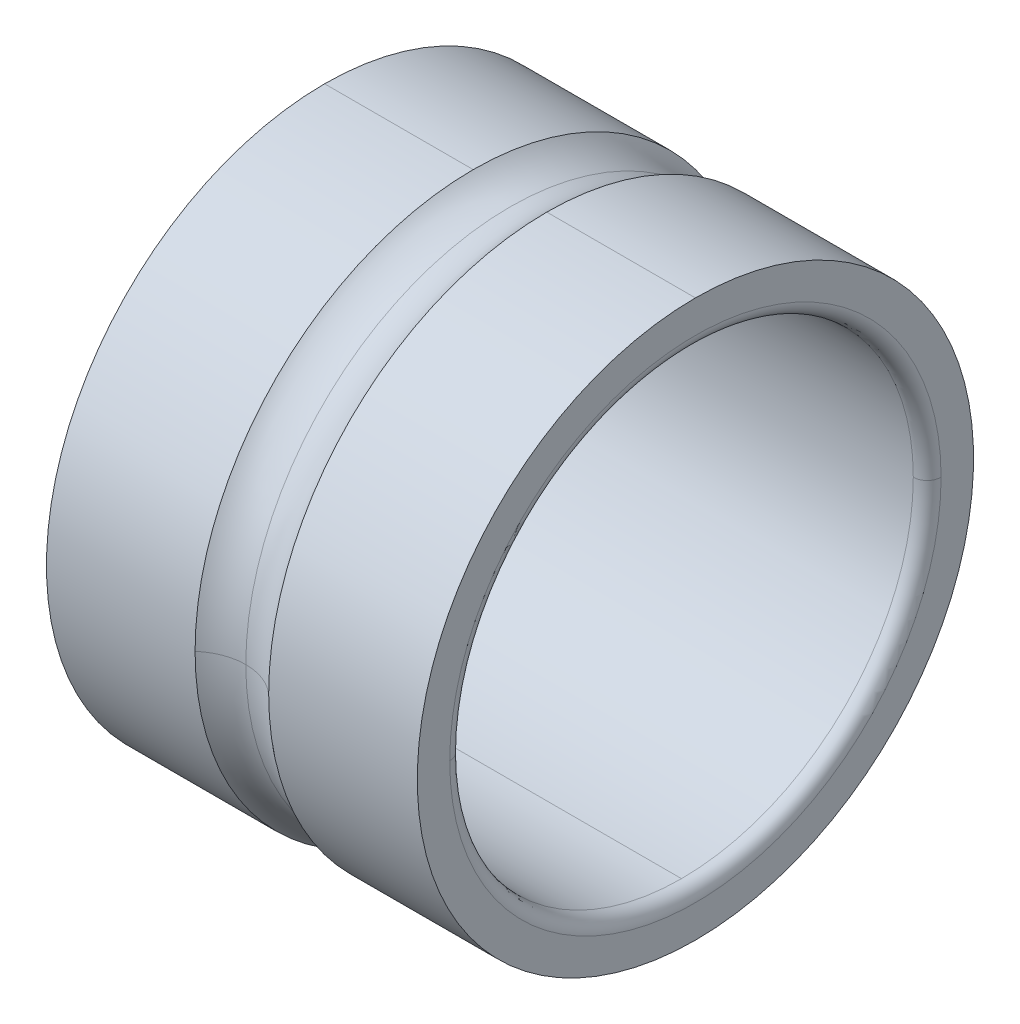
ISO-10303-21;
HEADER;
FILE_DESCRIPTION(('STEP AP214'),'2;1');
FILE_NAME('part.step','',(''),(''),'','','');
FILE_SCHEMA(('AUTOMOTIVE_DESIGN { 1 0 10303 214 1 1 1 1 }'));
ENDSEC;
DATA;
#1=APPLICATION_CONTEXT('core data for automotive mechanical design processes');
#2=APPLICATION_PROTOCOL_DEFINITION('international standard','automotive_design',2000,#1);
#3=PRODUCT_CONTEXT('',#1,'mechanical');
#4=PRODUCT('Part','Part','',(#3));
#5=PRODUCT_RELATED_PRODUCT_CATEGORY('part','',(#4));
#6=PRODUCT_DEFINITION_FORMATION('','',#4);
#7=PRODUCT_DEFINITION_CONTEXT('part definition',#1,'design');
#8=PRODUCT_DEFINITION('design','',#6,#7);
#9=PRODUCT_DEFINITION_SHAPE('','',#8);
#10=(LENGTH_UNIT() NAMED_UNIT(*) SI_UNIT(.MILLI.,.METRE.));
#11=(NAMED_UNIT(*) PLANE_ANGLE_UNIT() SI_UNIT($,.RADIAN.));
#12=(NAMED_UNIT(*) SI_UNIT($,.STERADIAN.) SOLID_ANGLE_UNIT());
#13=UNCERTAINTY_MEASURE_WITH_UNIT(LENGTH_MEASURE(1.E-05),#10,'distance_accuracy_value','');
#14=(GEOMETRIC_REPRESENTATION_CONTEXT(3) GLOBAL_UNCERTAINTY_ASSIGNED_CONTEXT((#13)) GLOBAL_UNIT_ASSIGNED_CONTEXT((#10,
#11,#12)) REPRESENTATION_CONTEXT('',''));
#15=CARTESIAN_POINT('',(0.,0.,0.));
#16=DIRECTION('',(0.,0.,1.));
#17=DIRECTION('',(1.,0.,0.));
#18=AXIS2_PLACEMENT_3D('',#15,#16,#17);
#19=CARTESIAN_POINT('',(3.19843134832985,0.,0.));
#20=DIRECTION('',(1.,0.,0.));
#21=DIRECTION('',(0.,1.,0.));
#22=AXIS2_PLACEMENT_3D('',#19,#20,#21);
#23=CYLINDRICAL_SURFACE('',#22,3.);
#24=DIRECTION('',(1.,0.,0.));
#25=VECTOR('',#24,1.);
#26=CARTESIAN_POINT('',(3.19843134832985,3.,0.));
#27=LINE('',#26,#25);
#28=CARTESIAN_POINT('',(2.39686269665969,3.,0.));
#29=VERTEX_POINT('',#28);
#30=CARTESIAN_POINT('',(4.,3.,0.));
#31=VERTEX_POINT('',#30);
#32=EDGE_CURVE('E184',#29,#31,#27,.T.);
#33=ORIENTED_EDGE('',*,*,#32,.T.);
#34=CARTESIAN_POINT('',(4.,0.,0.));
#35=DIRECTION('',(1.,0.,0.));
#36=DIRECTION('',(0.,1.,0.));
#37=AXIS2_PLACEMENT_3D('',#34,#35,#36);
#38=CIRCLE('',#37,3.);
#39=CARTESIAN_POINT('',(4.,-3.,0.));
#40=VERTEX_POINT('',#39);
#41=EDGE_CURVE('E137',#40,#31,#38,.T.);
#42=ORIENTED_EDGE('',*,*,#41,.F.);
#43=DIRECTION('',(-1.,0.,0.));
#44=VECTOR('',#43,1.);
#45=CARTESIAN_POINT('',(3.19843134832985,-3.,0.));
#46=LINE('',#45,#44);
#47=CARTESIAN_POINT('',(2.39686269665969,-3.,0.));
#48=VERTEX_POINT('',#47);
#49=EDGE_CURVE('E190',#40,#48,#46,.T.);
#50=ORIENTED_EDGE('',*,*,#49,.T.);
#51=CARTESIAN_POINT('',(2.39686269665969,0.,0.));
#52=DIRECTION('',(1.,0.,0.));
#53=DIRECTION('',(0.,1.,0.));
#54=AXIS2_PLACEMENT_3D('',#51,#52,#53);
#55=CIRCLE('',#54,3.);
#56=CARTESIAN_POINT('',(2.39686269665969,0.,-3.));
#57=VERTEX_POINT('',#56);
#58=EDGE_CURVE('E175',#48,#57,#55,.T.);
#59=ORIENTED_EDGE('',*,*,#58,.T.);
#60=CARTESIAN_POINT('',(2.39686269665969,0.,0.));
#61=DIRECTION('',(1.,0.,0.));
#62=DIRECTION('',(0.,1.,0.));
#63=AXIS2_PLACEMENT_3D('',#60,#61,#62);
#64=CIRCLE('',#63,3.);
#65=EDGE_CURVE('E181',#57,#29,#64,.T.);
#66=ORIENTED_EDGE('',*,*,#65,.T.);
#67=EDGE_LOOP('',(#33,#42,#50,#59,#66));
#68=FACE_BOUND('',#67,.T.);
#69=ADVANCED_FACE('F16',(#68),#23,.T.);
#70=CARTESIAN_POINT('',(2.,0.,0.));
#71=DIRECTION('',(1.,0.,0.));
#72=DIRECTION('',(0.,0.,-1.));
#73=AXIS2_PLACEMENT_3D('',#70,#71,#72);
#74=TOROIDAL_SURFACE('',#73,3.45,0.6);
#75=CARTESIAN_POINT('',(2.,0.,0.));
#76=DIRECTION('',(-1.,0.,0.));
#77=DIRECTION('',(0.,0.,1.));
#78=AXIS2_PLACEMENT_3D('',#75,#76,#77);
#79=CIRCLE('',#78,2.85);
#80=CARTESIAN_POINT('',(2.,0.,2.85));
#81=VERTEX_POINT('',#80);
#82=CARTESIAN_POINT('',(2.,0.,-2.85));
#83=VERTEX_POINT('',#82);
#84=EDGE_CURVE('E168',#81,#83,#79,.T.);
#85=ORIENTED_EDGE('',*,*,#84,.T.);
#86=CARTESIAN_POINT('',(2.,0.,-3.45));
#87=DIRECTION('',(0.,-1.,0.));
#88=DIRECTION('',(0.,0.,-1.));
#89=AXIS2_PLACEMENT_3D('',#86,#87,#88);
#90=CIRCLE('',#89,0.6);
#91=CARTESIAN_POINT('',(1.60313730334031,0.,-3.));
#92=VERTEX_POINT('',#91);
#93=EDGE_CURVE('E161',#83,#92,#90,.T.);
#94=ORIENTED_EDGE('',*,*,#93,.T.);
#95=CARTESIAN_POINT('',(1.60313730334031,0.,0.));
#96=DIRECTION('',(1.,0.,0.));
#97=DIRECTION('',(0.,1.,0.));
#98=AXIS2_PLACEMENT_3D('',#95,#96,#97);
#99=CIRCLE('',#98,3.);
#100=CARTESIAN_POINT('',(1.60313730334031,3.,0.));
#101=VERTEX_POINT('',#100);
#102=EDGE_CURVE('E11',#92,#101,#99,.T.);
#103=ORIENTED_EDGE('',*,*,#102,.T.);
#104=CARTESIAN_POINT('',(1.60313730334031,0.,0.));
#105=DIRECTION('',(1.,0.,0.));
#106=DIRECTION('',(0.,1.,0.));
#107=AXIS2_PLACEMENT_3D('',#104,#105,#106);
#108=CIRCLE('',#107,3.);
#109=CARTESIAN_POINT('',(1.60313730334031,0.,3.));
#110=VERTEX_POINT('',#109);
#111=EDGE_CURVE('E160',#101,#110,#108,.T.);
#112=ORIENTED_EDGE('',*,*,#111,.T.);
#113=CARTESIAN_POINT('',(2.,0.,3.45));
#114=DIRECTION('',(0.,-1.,0.));
#115=DIRECTION('',(0.,0.,1.));
#116=AXIS2_PLACEMENT_3D('',#113,#114,#115);
#117=CIRCLE('',#116,0.6);
#118=EDGE_CURVE('E200',#110,#81,#117,.T.);
#119=ORIENTED_EDGE('',*,*,#118,.T.);
#120=EDGE_LOOP('',(#85,#94,#103,#112,#119));
#121=FACE_BOUND('',#120,.T.);
#122=ADVANCED_FACE('F259',(#121),#74,.F.);
#123=CARTESIAN_POINT('',(0.801568651670155,0.,0.));
#124=DIRECTION('',(1.,0.,0.));
#125=DIRECTION('',(0.,1.,0.));
#126=AXIS2_PLACEMENT_3D('',#123,#124,#125);
#127=CYLINDRICAL_SURFACE('',#126,3.);
#128=DIRECTION('',(1.,0.,0.));
#129=VECTOR('',#128,1.);
#130=CARTESIAN_POINT('',(0.801568651670155,3.,0.));
#131=LINE('',#130,#129);
#132=CARTESIAN_POINT('',(0.,3.,0.));
#133=VERTEX_POINT('',#132);
#134=EDGE_CURVE('E149',#133,#101,#131,.T.);
#135=ORIENTED_EDGE('',*,*,#134,.T.);
#136=ORIENTED_EDGE('',*,*,#102,.F.);
#137=CARTESIAN_POINT('',(1.60313730334031,0.,0.));
#138=DIRECTION('',(1.,0.,0.));
#139=DIRECTION('',(0.,1.,0.));
#140=AXIS2_PLACEMENT_3D('',#137,#138,#139);
#141=CIRCLE('',#140,3.);
#142=CARTESIAN_POINT('',(1.60313730334031,-3.,0.));
#143=VERTEX_POINT('',#142);
#144=EDGE_CURVE('E164',#143,#92,#141,.T.);
#145=ORIENTED_EDGE('',*,*,#144,.F.);
#146=DIRECTION('',(-1.,0.,0.));
#147=VECTOR('',#146,1.);
#148=CARTESIAN_POINT('',(0.801568651670155,-3.,0.));
#149=LINE('',#148,#147);
#150=CARTESIAN_POINT('',(0.,-3.,0.));
#151=VERTEX_POINT('',#150);
#152=EDGE_CURVE('E151',#143,#151,#149,.T.);
#153=ORIENTED_EDGE('',*,*,#152,.T.);
#154=CARTESIAN_POINT('',(0.,0.,0.));
#155=DIRECTION('',(1.,0.,0.));
#156=DIRECTION('',(0.,1.,0.));
#157=AXIS2_PLACEMENT_3D('',#154,#155,#156);
#158=CIRCLE('',#157,3.);
#159=EDGE_CURVE('E24',#151,#133,#158,.T.);
#160=ORIENTED_EDGE('',*,*,#159,.T.);
#161=EDGE_LOOP('',(#135,#136,#145,#153,#160));
#162=FACE_BOUND('',#161,.T.);
#163=ADVANCED_FACE('F147',(#162),#127,.T.);
#164=CARTESIAN_POINT('',(0.,2.825,0.));
#165=DIRECTION('',(-1.,0.,0.));
#166=DIRECTION('',(0.,0.,1.));
#167=AXIS2_PLACEMENT_3D('',#164,#165,#166);
#168=PLANE('',#167);
#169=CARTESIAN_POINT('',(0.,0.,0.));
#170=DIRECTION('',(1.,0.,0.));
#171=DIRECTION('',(0.,1.,0.));
#172=AXIS2_PLACEMENT_3D('',#169,#170,#171);
#173=CIRCLE('',#172,2.65);
#174=CARTESIAN_POINT('',(0.,0.,2.65));
#175=VERTEX_POINT('',#174);
#176=CARTESIAN_POINT('',(0.,0.,-2.65));
#177=VERTEX_POINT('',#176);
#178=EDGE_CURVE('E141',#175,#177,#173,.T.);
#179=ORIENTED_EDGE('',*,*,#178,.T.);
#180=CARTESIAN_POINT('',(0.,0.,0.));
#181=DIRECTION('',(1.,0.,0.));
#182=DIRECTION('',(0.,1.,0.));
#183=AXIS2_PLACEMENT_3D('',#180,#181,#182);
#184=CIRCLE('',#183,2.65);
#185=EDGE_CURVE('E222',#177,#175,#184,.T.);
#186=ORIENTED_EDGE('',*,*,#185,.T.);
#187=EDGE_LOOP('',(#179,#186));
#188=FACE_BOUND('',#187,.T.);
#189=CARTESIAN_POINT('',(0.,0.,0.));
#190=DIRECTION('',(1.,0.,0.));
#191=DIRECTION('',(0.,1.,0.));
#192=AXIS2_PLACEMENT_3D('',#189,#190,#191);
#193=CIRCLE('',#192,3.);
#194=EDGE_CURVE('E154',#133,#151,#193,.T.);
#195=ORIENTED_EDGE('',*,*,#194,.F.);
#196=ORIENTED_EDGE('',*,*,#159,.F.);
#197=EDGE_LOOP('',(#195,#196));
#198=FACE_BOUND('',#197,.T.);
#199=ADVANCED_FACE('F18',(#188,#198),#168,.T.);
#200=CARTESIAN_POINT('',(0.15,0.,0.));
#201=DIRECTION('',(1.,0.,0.));
#202=DIRECTION('',(0.,0.,-1.));
#203=AXIS2_PLACEMENT_3D('',#200,#201,#202);
#204=TOROIDAL_SURFACE('',#203,2.65,0.15);
#205=CARTESIAN_POINT('',(0.15,0.,-2.65));
#206=DIRECTION('',(0.,-1.,0.));
#207=DIRECTION('',(0.,0.,-1.));
#208=AXIS2_PLACEMENT_3D('',#205,#206,#207);
#209=CIRCLE('',#208,0.15);
#210=CARTESIAN_POINT('',(0.15,0.,-2.5));
#211=VERTEX_POINT('',#210);
#212=EDGE_CURVE('E210',#211,#177,#209,.T.);
#213=ORIENTED_EDGE('',*,*,#212,.T.);
#214=ORIENTED_EDGE('',*,*,#178,.F.);
#215=CARTESIAN_POINT('',(0.15,0.,2.65));
#216=DIRECTION('',(0.,-1.,0.));
#217=DIRECTION('',(0.,0.,1.));
#218=AXIS2_PLACEMENT_3D('',#215,#216,#217);
#219=CIRCLE('',#218,0.15);
#220=CARTESIAN_POINT('',(0.15,0.,2.5));
#221=VERTEX_POINT('',#220);
#222=EDGE_CURVE('E219',#175,#221,#219,.T.);
#223=ORIENTED_EDGE('',*,*,#222,.T.);
#224=CARTESIAN_POINT('',(0.15,0.,0.));
#225=DIRECTION('',(1.,0.,0.));
#226=DIRECTION('',(0.,1.,0.));
#227=AXIS2_PLACEMENT_3D('',#224,#225,#226);
#228=CIRCLE('',#227,2.5);
#229=CARTESIAN_POINT('',(0.15,-2.5,0.));
#230=VERTEX_POINT('',#229);
#231=EDGE_CURVE('E139',#221,#230,#228,.T.);
#232=ORIENTED_EDGE('',*,*,#231,.T.);
#233=CARTESIAN_POINT('',(0.15,0.,0.));
#234=DIRECTION('',(1.,0.,0.));
#235=DIRECTION('',(0.,1.,0.));
#236=AXIS2_PLACEMENT_3D('',#233,#234,#235);
#237=CIRCLE('',#236,2.5);
#238=EDGE_CURVE('E130',#230,#211,#237,.T.);
#239=ORIENTED_EDGE('',*,*,#238,.T.);
#240=EDGE_LOOP('',(#213,#214,#223,#232,#239));
#241=FACE_BOUND('',#240,.T.);
#242=ADVANCED_FACE('F228',(#241),#204,.T.);
#243=CARTESIAN_POINT('',(2.,0.,0.));
#244=DIRECTION('',(1.,0.,0.));
#245=DIRECTION('',(0.,1.,0.));
#246=AXIS2_PLACEMENT_3D('',#243,#244,#245);
#247=CYLINDRICAL_SURFACE('',#246,2.5);
#248=DIRECTION('',(1.,0.,0.));
#249=VECTOR('',#248,1.);
#250=CARTESIAN_POINT('',(2.,2.5,0.));
#251=LINE('',#250,#249);
#252=CARTESIAN_POINT('',(0.15,2.5,0.));
#253=VERTEX_POINT('',#252);
#254=CARTESIAN_POINT('',(3.85,2.5,0.));
#255=VERTEX_POINT('',#254);
#256=EDGE_CURVE('E225',#253,#255,#251,.T.);
#257=ORIENTED_EDGE('',*,*,#256,.T.);
#258=CARTESIAN_POINT('',(3.85,0.,0.));
#259=DIRECTION('',(1.,0.,0.));
#260=DIRECTION('',(0.,1.,0.));
#261=AXIS2_PLACEMENT_3D('',#258,#259,#260);
#262=CIRCLE('',#261,2.5);
#263=CARTESIAN_POINT('',(3.85,0.,2.5));
#264=VERTEX_POINT('',#263);
#265=EDGE_CURVE('E121',#255,#264,#262,.T.);
#266=ORIENTED_EDGE('',*,*,#265,.T.);
#267=CARTESIAN_POINT('',(3.85,0.,0.));
#268=DIRECTION('',(1.,0.,0.));
#269=DIRECTION('',(0.,1.,0.));
#270=AXIS2_PLACEMENT_3D('',#267,#268,#269);
#271=CIRCLE('',#270,2.5);
#272=CARTESIAN_POINT('',(3.85,-2.5,0.));
#273=VERTEX_POINT('',#272);
#274=EDGE_CURVE('E31',#264,#273,#271,.T.);
#275=ORIENTED_EDGE('',*,*,#274,.T.);
#276=DIRECTION('',(-1.,0.,0.));
#277=VECTOR('',#276,1.);
#278=CARTESIAN_POINT('',(2.,-2.5,0.));
#279=LINE('',#278,#277);
#280=EDGE_CURVE('E128',#273,#230,#279,.T.);
#281=ORIENTED_EDGE('',*,*,#280,.T.);
#282=ORIENTED_EDGE('',*,*,#231,.F.);
#283=CARTESIAN_POINT('',(0.15,0.,0.));
#284=DIRECTION('',(1.,0.,0.));
#285=DIRECTION('',(0.,1.,0.));
#286=AXIS2_PLACEMENT_3D('',#283,#284,#285);
#287=CIRCLE('',#286,2.5);
#288=EDGE_CURVE('E216',#253,#221,#287,.T.);
#289=ORIENTED_EDGE('',*,*,#288,.F.);
#290=EDGE_LOOP('',(#257,#266,#275,#281,#282,#289));
#291=FACE_BOUND('',#290,.T.);
#292=ADVANCED_FACE('F237',(#291),#247,.F.);
#293=CARTESIAN_POINT('',(3.85,0.,0.));
#294=DIRECTION('',(1.,0.,0.));
#295=DIRECTION('',(0.,0.,-1.));
#296=AXIS2_PLACEMENT_3D('',#293,#294,#295);
#297=TOROIDAL_SURFACE('',#296,2.65,0.15);
#298=CARTESIAN_POINT('',(3.85,0.,-2.65));
#299=DIRECTION('',(0.,-1.,0.));
#300=DIRECTION('',(0.,0.,-1.));
#301=AXIS2_PLACEMENT_3D('',#298,#299,#300);
#302=CIRCLE('',#301,0.15);
#303=CARTESIAN_POINT('',(4.,0.,-2.65));
#304=VERTEX_POINT('',#303);
#305=CARTESIAN_POINT('',(3.85,0.,-2.5));
#306=VERTEX_POINT('',#305);
#307=EDGE_CURVE('E107',#304,#306,#302,.T.);
#308=ORIENTED_EDGE('',*,*,#307,.T.);
#309=CARTESIAN_POINT('',(3.85,0.,0.));
#310=DIRECTION('',(1.,0.,0.));
#311=DIRECTION('',(0.,1.,0.));
#312=AXIS2_PLACEMENT_3D('',#309,#310,#311);
#313=CIRCLE('',#312,2.5);
#314=EDGE_CURVE('E111',#273,#306,#313,.T.);
#315=ORIENTED_EDGE('',*,*,#314,.F.);
#316=ORIENTED_EDGE('',*,*,#274,.F.);
#317=CARTESIAN_POINT('',(3.85,0.,2.65));
#318=DIRECTION('',(0.,-1.,0.));
#319=DIRECTION('',(0.,0.,1.));
#320=AXIS2_PLACEMENT_3D('',#317,#318,#319);
#321=CIRCLE('',#320,0.15);
#322=CARTESIAN_POINT('',(4.,0.,2.65));
#323=VERTEX_POINT('',#322);
#324=EDGE_CURVE('E134',#264,#323,#321,.T.);
#325=ORIENTED_EDGE('',*,*,#324,.T.);
#326=CARTESIAN_POINT('',(4.,0.,0.));
#327=DIRECTION('',(1.,0.,0.));
#328=DIRECTION('',(0.,1.,0.));
#329=AXIS2_PLACEMENT_3D('',#326,#327,#328);
#330=CIRCLE('',#329,2.65);
#331=EDGE_CURVE('E39',#323,#304,#330,.T.);
#332=ORIENTED_EDGE('',*,*,#331,.T.);
#333=EDGE_LOOP('',(#308,#315,#316,#325,#332));
#334=FACE_BOUND('',#333,.T.);
#335=ADVANCED_FACE('F109',(#334),#297,.T.);
#336=CARTESIAN_POINT('',(4.,2.825,0.));
#337=DIRECTION('',(1.,0.,0.));
#338=DIRECTION('',(0.,1.,0.));
#339=AXIS2_PLACEMENT_3D('',#336,#337,#338);
#340=PLANE('',#339);
#341=CARTESIAN_POINT('',(4.,0.,0.));
#342=DIRECTION('',(1.,0.,0.));
#343=DIRECTION('',(0.,1.,0.));
#344=AXIS2_PLACEMENT_3D('',#341,#342,#343);
#345=CIRCLE('',#344,2.65);
#346=EDGE_CURVE('E115',#304,#323,#345,.T.);
#347=ORIENTED_EDGE('',*,*,#346,.F.);
#348=ORIENTED_EDGE('',*,*,#331,.F.);
#349=EDGE_LOOP('',(#347,#348));
#350=FACE_BOUND('',#349,.T.);
#351=CARTESIAN_POINT('',(4.,0.,0.));
#352=DIRECTION('',(1.,0.,0.));
#353=DIRECTION('',(0.,1.,0.));
#354=AXIS2_PLACEMENT_3D('',#351,#352,#353);
#355=CIRCLE('',#354,3.);
#356=EDGE_CURVE('E192',#31,#40,#355,.T.);
#357=ORIENTED_EDGE('',*,*,#356,.T.);
#358=ORIENTED_EDGE('',*,*,#41,.T.);
#359=EDGE_LOOP('',(#357,#358));
#360=FACE_BOUND('',#359,.T.);
#361=ADVANCED_FACE('F238',(#350,#360),#340,.T.);
#362=CARTESIAN_POINT('',(3.85,0.,0.));
#363=DIRECTION('',(1.,0.,0.));
#364=DIRECTION('',(0.,0.,-1.));
#365=AXIS2_PLACEMENT_3D('',#362,#363,#364);
#366=TOROIDAL_SURFACE('',#365,2.65,0.15);
#367=ORIENTED_EDGE('',*,*,#307,.F.);
#368=ORIENTED_EDGE('',*,*,#346,.T.);
#369=ORIENTED_EDGE('',*,*,#324,.F.);
#370=ORIENTED_EDGE('',*,*,#265,.F.);
#371=CARTESIAN_POINT('',(3.85,0.,0.));
#372=DIRECTION('',(1.,0.,0.));
#373=DIRECTION('',(0.,1.,0.));
#374=AXIS2_PLACEMENT_3D('',#371,#372,#373);
#375=CIRCLE('',#374,2.5);
#376=EDGE_CURVE('E116',#306,#255,#375,.T.);
#377=ORIENTED_EDGE('',*,*,#376,.F.);
#378=EDGE_LOOP('',(#367,#368,#369,#370,#377));
#379=FACE_BOUND('',#378,.T.);
#380=ADVANCED_FACE('F119',(#379),#366,.T.);
#381=CARTESIAN_POINT('',(2.,0.,0.));
#382=DIRECTION('',(1.,0.,0.));
#383=DIRECTION('',(0.,1.,0.));
#384=AXIS2_PLACEMENT_3D('',#381,#382,#383);
#385=CYLINDRICAL_SURFACE('',#384,2.5);
#386=ORIENTED_EDGE('',*,*,#256,.F.);
#387=CARTESIAN_POINT('',(0.15,0.,0.));
#388=DIRECTION('',(1.,0.,0.));
#389=DIRECTION('',(0.,1.,0.));
#390=AXIS2_PLACEMENT_3D('',#387,#388,#389);
#391=CIRCLE('',#390,2.5);
#392=EDGE_CURVE('E213',#211,#253,#391,.T.);
#393=ORIENTED_EDGE('',*,*,#392,.F.);
#394=ORIENTED_EDGE('',*,*,#238,.F.);
#395=ORIENTED_EDGE('',*,*,#280,.F.);
#396=ORIENTED_EDGE('',*,*,#314,.T.);
#397=ORIENTED_EDGE('',*,*,#376,.T.);
#398=EDGE_LOOP('',(#386,#393,#394,#395,#396,#397));
#399=FACE_BOUND('',#398,.T.);
#400=ADVANCED_FACE('F125',(#399),#385,.F.);
#401=CARTESIAN_POINT('',(0.15,0.,0.));
#402=DIRECTION('',(1.,0.,0.));
#403=DIRECTION('',(0.,0.,-1.));
#404=AXIS2_PLACEMENT_3D('',#401,#402,#403);
#405=TOROIDAL_SURFACE('',#404,2.65,0.15);
#406=ORIENTED_EDGE('',*,*,#212,.F.);
#407=ORIENTED_EDGE('',*,*,#392,.T.);
#408=ORIENTED_EDGE('',*,*,#288,.T.);
#409=ORIENTED_EDGE('',*,*,#222,.F.);
#410=ORIENTED_EDGE('',*,*,#185,.F.);
#411=EDGE_LOOP('',(#406,#407,#408,#409,#410));
#412=FACE_BOUND('',#411,.T.);
#413=ADVANCED_FACE('F233',(#412),#405,.T.);
#414=CARTESIAN_POINT('',(0.801568651670155,0.,0.));
#415=DIRECTION('',(1.,0.,0.));
#416=DIRECTION('',(0.,1.,0.));
#417=AXIS2_PLACEMENT_3D('',#414,#415,#416);
#418=CYLINDRICAL_SURFACE('',#417,3.);
#419=ORIENTED_EDGE('',*,*,#134,.F.);
#420=ORIENTED_EDGE('',*,*,#194,.T.);
#421=ORIENTED_EDGE('',*,*,#152,.F.);
#422=CARTESIAN_POINT('',(1.60313730334031,0.,0.));
#423=DIRECTION('',(1.,0.,0.));
#424=DIRECTION('',(0.,1.,0.));
#425=AXIS2_PLACEMENT_3D('',#422,#423,#424);
#426=CIRCLE('',#425,3.);
#427=EDGE_CURVE('E202',#110,#143,#426,.T.);
#428=ORIENTED_EDGE('',*,*,#427,.F.);
#429=ORIENTED_EDGE('',*,*,#111,.F.);
#430=EDGE_LOOP('',(#419,#420,#421,#428,#429));
#431=FACE_BOUND('',#430,.T.);
#432=ADVANCED_FACE('F158',(#431),#418,.T.);
#433=CARTESIAN_POINT('',(2.,0.,0.));
#434=DIRECTION('',(1.,0.,0.));
#435=DIRECTION('',(0.,0.,-1.));
#436=AXIS2_PLACEMENT_3D('',#433,#434,#435);
#437=TOROIDAL_SURFACE('',#436,3.45,0.6);
#438=CARTESIAN_POINT('',(2.,0.,0.));
#439=DIRECTION('',(-1.,0.,0.));
#440=DIRECTION('',(0.,0.,1.));
#441=AXIS2_PLACEMENT_3D('',#438,#439,#440);
#442=CIRCLE('',#441,2.85);
#443=EDGE_CURVE('E178',#83,#81,#442,.T.);
#444=ORIENTED_EDGE('',*,*,#443,.T.);
#445=ORIENTED_EDGE('',*,*,#118,.F.);
#446=ORIENTED_EDGE('',*,*,#427,.T.);
#447=ORIENTED_EDGE('',*,*,#144,.T.);
#448=ORIENTED_EDGE('',*,*,#93,.F.);
#449=EDGE_LOOP('',(#444,#445,#446,#447,#448));
#450=FACE_BOUND('',#449,.T.);
#451=ADVANCED_FACE('F262',(#450),#437,.F.);
#452=CARTESIAN_POINT('',(3.19843134832985,0.,0.));
#453=DIRECTION('',(1.,0.,0.));
#454=DIRECTION('',(0.,1.,0.));
#455=AXIS2_PLACEMENT_3D('',#452,#453,#454);
#456=CYLINDRICAL_SURFACE('',#455,3.);
#457=ORIENTED_EDGE('',*,*,#32,.F.);
#458=CARTESIAN_POINT('',(2.39686269665969,0.,0.));
#459=DIRECTION('',(1.,0.,0.));
#460=DIRECTION('',(0.,1.,0.));
#461=AXIS2_PLACEMENT_3D('',#458,#459,#460);
#462=CIRCLE('',#461,3.);
#463=CARTESIAN_POINT('',(2.39686269665969,0.,3.));
#464=VERTEX_POINT('',#463);
#465=EDGE_CURVE('E174',#29,#464,#462,.T.);
#466=ORIENTED_EDGE('',*,*,#465,.T.);
#467=CARTESIAN_POINT('',(2.39686269665969,0.,0.));
#468=DIRECTION('',(1.,0.,0.));
#469=DIRECTION('',(0.,1.,0.));
#470=AXIS2_PLACEMENT_3D('',#467,#468,#469);
#471=CIRCLE('',#470,3.);
#472=EDGE_CURVE('E177',#464,#48,#471,.T.);
#473=ORIENTED_EDGE('',*,*,#472,.T.);
#474=ORIENTED_EDGE('',*,*,#49,.F.);
#475=ORIENTED_EDGE('',*,*,#356,.F.);
#476=EDGE_LOOP('',(#457,#466,#473,#474,#475));
#477=FACE_BOUND('',#476,.T.);
#478=ADVANCED_FACE('F245',(#477),#456,.T.);
#479=CARTESIAN_POINT('',(2.,0.,0.));
#480=DIRECTION('',(1.,0.,0.));
#481=DIRECTION('',(0.,0.,-1.));
#482=AXIS2_PLACEMENT_3D('',#479,#480,#481);
#483=TOROIDAL_SURFACE('',#482,3.45,0.6);
#484=ORIENTED_EDGE('',*,*,#443,.F.);
#485=CARTESIAN_POINT('',(2.,0.,-3.45));
#486=DIRECTION('',(0.,-1.,0.));
#487=DIRECTION('',(0.,0.,-1.));
#488=AXIS2_PLACEMENT_3D('',#485,#486,#487);
#489=CIRCLE('',#488,0.6);
#490=EDGE_CURVE('E187',#57,#83,#489,.T.);
#491=ORIENTED_EDGE('',*,*,#490,.F.);
#492=ORIENTED_EDGE('',*,*,#58,.F.);
#493=ORIENTED_EDGE('',*,*,#472,.F.);
#494=CARTESIAN_POINT('',(2.,0.,3.45));
#495=DIRECTION('',(0.,-1.,0.));
#496=DIRECTION('',(0.,0.,1.));
#497=AXIS2_PLACEMENT_3D('',#494,#495,#496);
#498=CIRCLE('',#497,0.6);
#499=EDGE_CURVE('E171',#81,#464,#498,.T.);
#500=ORIENTED_EDGE('',*,*,#499,.F.);
#501=EDGE_LOOP('',(#484,#491,#492,#493,#500));
#502=FACE_BOUND('',#501,.T.);
#503=ADVANCED_FACE('F257',(#502),#483,.F.);
#504=CARTESIAN_POINT('',(2.,0.,0.));
#505=DIRECTION('',(1.,0.,0.));
#506=DIRECTION('',(0.,0.,-1.));
#507=AXIS2_PLACEMENT_3D('',#504,#505,#506);
#508=TOROIDAL_SURFACE('',#507,3.45,0.6);
#509=ORIENTED_EDGE('',*,*,#84,.F.);
#510=ORIENTED_EDGE('',*,*,#499,.T.);
#511=ORIENTED_EDGE('',*,*,#465,.F.);
#512=ORIENTED_EDGE('',*,*,#65,.F.);
#513=ORIENTED_EDGE('',*,*,#490,.T.);
#514=EDGE_LOOP('',(#509,#510,#511,#512,#513));
#515=FACE_BOUND('',#514,.T.);
#516=ADVANCED_FACE('F254',(#515),#508,.F.);
#517=CLOSED_SHELL('',(#69,#122,#163,#199,#242,#292,#335,#361,#380,#400,#413,#432,#451,#478,#503,#516));
#518=MANIFOLD_SOLID_BREP('B1',#517);
#519=ADVANCED_BREP_SHAPE_REPRESENTATION('',(#18,#518),#14);
#520=SHAPE_DEFINITION_REPRESENTATION(#9,#519);
ENDSEC;
END-ISO-10303-21;
